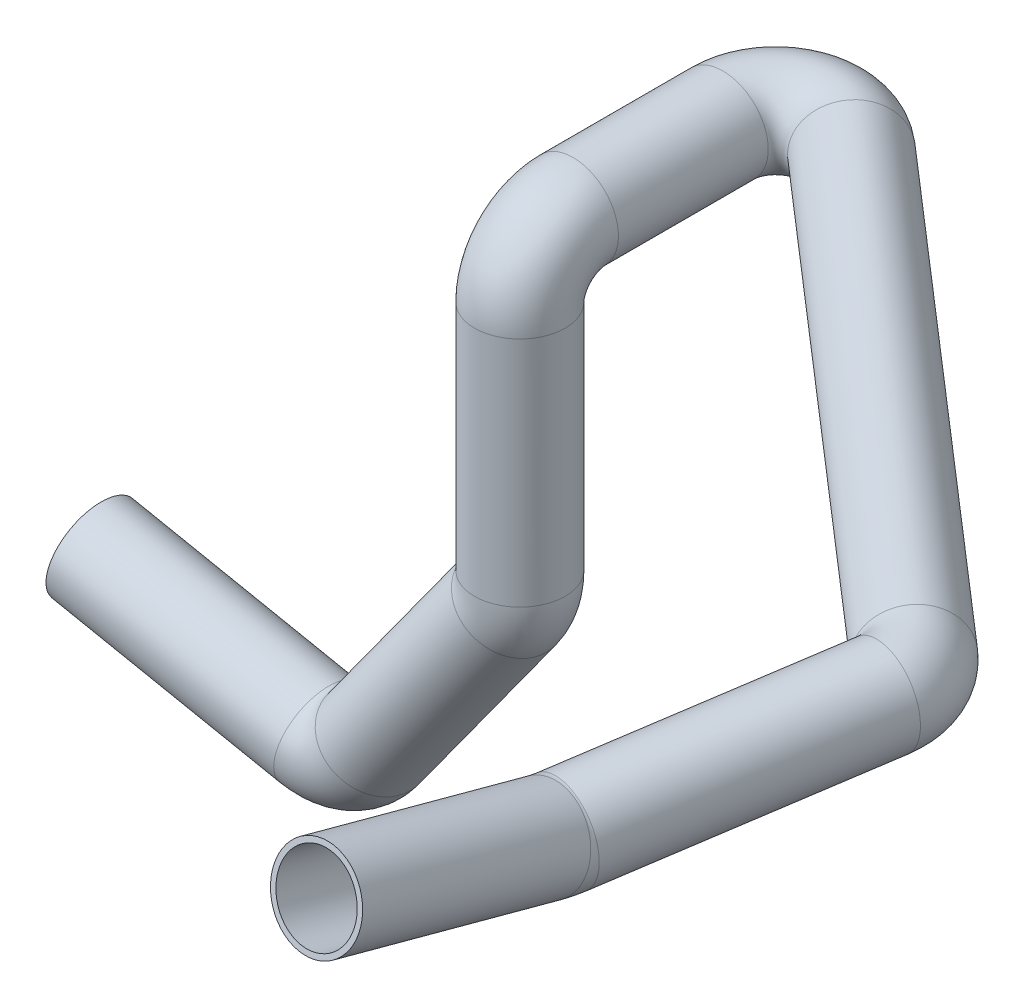
ISO-10303-21;
HEADER;
FILE_DESCRIPTION(('STEP AP214'),'2;1');
FILE_NAME('part.step','',(''),(''),'','','');
FILE_SCHEMA(('AUTOMOTIVE_DESIGN { 1 0 10303 214 1 1 1 1 }'));
ENDSEC;
DATA;
#1=APPLICATION_CONTEXT('core data for automotive mechanical design processes');
#2=APPLICATION_PROTOCOL_DEFINITION('international standard','automotive_design',2000,#1);
#3=PRODUCT_CONTEXT('',#1,'mechanical');
#4=PRODUCT('Part','Part','',(#3));
#5=PRODUCT_RELATED_PRODUCT_CATEGORY('part','',(#4));
#6=PRODUCT_DEFINITION_FORMATION('','',#4);
#7=PRODUCT_DEFINITION_CONTEXT('part definition',#1,'design');
#8=PRODUCT_DEFINITION('design','',#6,#7);
#9=PRODUCT_DEFINITION_SHAPE('','',#8);
#10=(LENGTH_UNIT() NAMED_UNIT(*) SI_UNIT(.MILLI.,.METRE.));
#11=(NAMED_UNIT(*) PLANE_ANGLE_UNIT() SI_UNIT($,.RADIAN.));
#12=(NAMED_UNIT(*) SI_UNIT($,.STERADIAN.) SOLID_ANGLE_UNIT());
#13=UNCERTAINTY_MEASURE_WITH_UNIT(LENGTH_MEASURE(1.E-05),#10,'distance_accuracy_value','');
#14=(GEOMETRIC_REPRESENTATION_CONTEXT(3) GLOBAL_UNCERTAINTY_ASSIGNED_CONTEXT((#13)) GLOBAL_UNIT_ASSIGNED_CONTEXT((#10,
#11,#12)) REPRESENTATION_CONTEXT('',''));
#15=CARTESIAN_POINT('',(0.,0.,0.));
#16=DIRECTION('',(0.,0.,1.));
#17=DIRECTION('',(1.,0.,0.));
#18=AXIS2_PLACEMENT_3D('',#15,#16,#17);
#19=CARTESIAN_POINT('',(1.11022302462516E-13,0.,0.));
#20=DIRECTION('',(-0.980523442214613,0.196402085700758,0.));
#21=DIRECTION('',(-0.00855716664980716,-0.042721045803236,0.999050392695186));
#22=AXIS2_PLACEMENT_3D('',#19,#20,#21);
#23=PLANE('',#22);
#24=CARTESIAN_POINT('',(1.11022302462516E-13,0.,0.));
#25=DIRECTION('',(-0.980523442214613,0.196402085700758,0.));
#26=DIRECTION('',(-0.00855716664980716,-0.042721045803236,0.999050392695186));
#27=AXIS2_PLACEMENT_3D('',#24,#25,#26);
#28=CIRCLE('',#27,15.);
#29=CARTESIAN_POINT('',(-0.128357499746996,-0.64081568704854,14.9857558904277));
#30=VERTEX_POINT('',#29);
#31=EDGE_CURVE('E403',#30,#30,#28,.T.);
#32=ORIENTED_EDGE('',*,*,#31,.F.);
#33=EDGE_LOOP('',(#32));
#34=FACE_BOUND('',#33,.T.);
#35=CARTESIAN_POINT('',(1.11022302462516E-13,0.,0.));
#36=DIRECTION('',(-0.980523442214613,0.196402085700758,0.));
#37=DIRECTION('',(-0.196402085700758,-0.980523442214612,0.));
#38=AXIS2_PLACEMENT_3D('',#35,#36,#37);
#39=CIRCLE('',#38,17.);
#40=CARTESIAN_POINT('',(-3.33883545691277,-16.6688985176484,0.));
#41=VERTEX_POINT('',#40);
#42=EDGE_CURVE('E62',#41,#41,#39,.T.);
#43=ORIENTED_EDGE('',*,*,#42,.T.);
#44=EDGE_LOOP('',(#43));
#45=FACE_BOUND('',#44,.T.);
#46=ADVANCED_FACE('F43',(#34,#45),#23,.T.);
#47=CARTESIAN_POINT('',(356.08970432357,200.149000261823,271.863945724167));
#48=DIRECTION('',(0.0144610619983853,-0.251041204899165,-0.967868374898495));
#49=DIRECTION('',(0.,0.967969592211033,-0.2510674581757));
#50=AXIS2_PLACEMENT_3D('',#47,#48,#49);
#51=PLANE('',#50);
#52=CARTESIAN_POINT('',(356.08970432357,200.149000261823,271.863945724167));
#53=DIRECTION('',(0.0144610619983853,-0.251041204899165,-0.967868374898495));
#54=DIRECTION('',(0.,0.967969592211033,-0.2510674581757));
#55=AXIS2_PLACEMENT_3D('',#52,#53,#54);
#56=CIRCLE('',#55,15.);
#57=CARTESIAN_POINT('',(356.08970432357,214.668544144988,268.097933851532));
#58=VERTEX_POINT('',#57);
#59=EDGE_CURVE('E65',#58,#58,#56,.T.);
#60=ORIENTED_EDGE('',*,*,#59,.T.);
#61=EDGE_LOOP('',(#60));
#62=FACE_BOUND('',#61,.T.);
#63=CARTESIAN_POINT('',(356.08970432357,200.149000261823,271.863945724167));
#64=DIRECTION('',(0.0144610619983853,-0.251041204899165,-0.967868374898495));
#65=DIRECTION('',(0.,0.967969592211033,-0.2510674581757));
#66=AXIS2_PLACEMENT_3D('',#63,#64,#65);
#67=CIRCLE('',#66,17.);
#68=CARTESIAN_POINT('',(356.08970432357,216.60448332941,267.595798935181));
#69=VERTEX_POINT('',#68);
#70=EDGE_CURVE('E11',#69,#69,#67,.T.);
#71=ORIENTED_EDGE('',*,*,#70,.F.);
#72=EDGE_LOOP('',(#71));
#73=FACE_BOUND('',#72,.T.);
#74=ADVANCED_FACE('F181',(#62,#73),#51,.F.);
#75=CARTESIAN_POINT('',(1.11022302462516E-13,0.,0.));
#76=DIRECTION('',(0.980523442214612,-0.196402085700759,0.));
#77=DIRECTION('',(0.196402085700759,0.980523442214612,0.));
#78=AXIS2_PLACEMENT_3D('',#75,#76,#77);
#79=CYLINDRICAL_SURFACE('',#78,17.);
#80=CARTESIAN_POINT('',(85.4614389727629,-17.1182086410179,0.));
#81=DIRECTION('',(0.980523442214612,-0.196402085700759,0.));
#82=DIRECTION('',(0.196402085700759,0.980523442214612,0.));
#83=AXIS2_PLACEMENT_3D('',#80,#81,#82);
#84=CIRCLE('',#83,17.);
#85=CARTESIAN_POINT('',(82.1226035158501,-33.7871071586663,0.));
#86=VERTEX_POINT('',#85);
#87=EDGE_CURVE('E64',#86,#86,#84,.F.);
#88=ORIENTED_EDGE('',*,*,#87,.T.);
#89=EDGE_LOOP('',(#88));
#90=FACE_BOUND('',#89,.T.);
#91=ORIENTED_EDGE('',*,*,#42,.F.);
#92=EDGE_LOOP('',(#91));
#93=FACE_BOUND('',#92,.T.);
#94=ADVANCED_FACE('F184',(#90,#93),#79,.T.);
#95=CARTESIAN_POINT('',(89.389480686778,2.49226020327438,0.));
#96=DIRECTION('',(0.,0.,1.));
#97=DIRECTION('',(1.,0.,0.));
#98=AXIS2_PLACEMENT_3D('',#95,#96,#97);
#99=TOROIDAL_SURFACE('',#98,20.,17.);
#100=CARTESIAN_POINT('',(105.585882460792,-9.24130573273696,0.));
#101=DIRECTION('',(-0.586678296800567,-0.809820088700685,0.));
#102=DIRECTION('',(0.809820088700685,-0.586678296800567,0.));
#103=AXIS2_PLACEMENT_3D('',#100,#101,#102);
#104=CIRCLE('',#103,17.);
#105=CARTESIAN_POINT('',(119.352823968703,-19.2148367783466,0.));
#106=VERTEX_POINT('',#105);
#107=EDGE_CURVE('E69',#106,#106,#104,.T.);
#108=CARTESIAN_POINT('',(89.389480686778,2.49226020327438,0.));
#109=DIRECTION('',(0.,0.,1.));
#110=DIRECTION('',(1.,0.,0.));
#111=AXIS2_PLACEMENT_3D('',#108,#109,#110);
#112=CIRCLE('',#111,37.);
#113=EDGE_CURVE('',#86,#106,#112,.T.);
#114=ORIENTED_EDGE('',*,*,#87,.F.);
#115=ORIENTED_EDGE('',*,*,#107,.T.);
#116=ORIENTED_EDGE('',*,*,#113,.T.);
#117=ORIENTED_EDGE('',*,*,#113,.F.);
#118=EDGE_LOOP('',(#114,#116,#115,#117));
#119=FACE_BOUND('',#118,.T.);
#120=ADVANCED_FACE('F190',(#119),#99,.T.);
#121=CARTESIAN_POINT('',(105.585882460792,-9.24130573273701,0.));
#122=DIRECTION('',(0.58667829680057,0.809820088700683,0.));
#123=DIRECTION('',(-0.809820088700683,0.58667829680057,0.));
#124=AXIS2_PLACEMENT_3D('',#121,#122,#123);
#125=CYLINDRICAL_SURFACE('',#124,17.);
#126=CARTESIAN_POINT('',(156.720173901518,61.3418002999924,0.));
#127=DIRECTION('',(0.58667829680057,0.809820088700683,0.));
#128=DIRECTION('',(-0.809820088700683,0.58667829680057,0.));
#129=AXIS2_PLACEMENT_3D('',#126,#127,#128);
#130=CIRCLE('',#129,17.);
#131=CARTESIAN_POINT('',(170.48711540943,51.3682692543827,0.));
#132=VERTEX_POINT('',#131);
#133=EDGE_CURVE('E83',#132,#132,#130,.F.);
#134=ORIENTED_EDGE('',*,*,#133,.T.);
#135=EDGE_LOOP('',(#134));
#136=FACE_BOUND('',#135,.T.);
#137=ORIENTED_EDGE('',*,*,#107,.F.);
#138=EDGE_LOOP('',(#137));
#139=FACE_BOUND('',#138,.T.);
#140=ADVANCED_FACE('F194',(#136,#139),#125,.T.);
#141=CARTESIAN_POINT('',(140.523772127505,73.0753662360038,0.));
#142=DIRECTION('',(0.,0.,1.));
#143=DIRECTION('',(1.,0.,0.));
#144=AXIS2_PLACEMENT_3D('',#141,#142,#143);
#145=TOROIDAL_SURFACE('',#144,20.0000000000001,17.);
#146=CARTESIAN_POINT('',(160.523772127505,73.0753662360039,0.));
#147=DIRECTION('',(0.,-1.,0.));
#148=DIRECTION('',(1.,0.,0.));
#149=AXIS2_PLACEMENT_3D('',#146,#147,#148);
#150=CIRCLE('',#149,17.);
#151=CARTESIAN_POINT('',(177.523772127505,73.0753662360039,0.));
#152=VERTEX_POINT('',#151);
#153=EDGE_CURVE('E86',#152,#152,#150,.T.);
#154=CARTESIAN_POINT('',(140.523772127505,73.0753662360038,0.));
#155=DIRECTION('',(0.,0.,1.));
#156=DIRECTION('',(1.,0.,0.));
#157=AXIS2_PLACEMENT_3D('',#154,#155,#156);
#158=CIRCLE('',#157,37.0000000000001);
#159=EDGE_CURVE('',#132,#152,#158,.T.);
#160=ORIENTED_EDGE('',*,*,#133,.F.);
#161=ORIENTED_EDGE('',*,*,#153,.T.);
#162=ORIENTED_EDGE('',*,*,#159,.T.);
#163=ORIENTED_EDGE('',*,*,#159,.F.);
#164=EDGE_LOOP('',(#160,#162,#161,#163));
#165=FACE_BOUND('',#164,.T.);
#166=ADVANCED_FACE('F198',(#165),#145,.T.);
#167=CARTESIAN_POINT('',(160.523772127505,73.0753662360039,0.));
#168=DIRECTION('',(0.,1.,0.));
#169=DIRECTION('',(-1.,0.,0.));
#170=AXIS2_PLACEMENT_3D('',#167,#168,#169);
#171=CYLINDRICAL_SURFACE('',#170,17.);
#172=CARTESIAN_POINT('',(160.523772127505,160.234362434748,0.));
#173=DIRECTION('',(0.,1.,0.));
#174=DIRECTION('',(-1.,0.,0.));
#175=AXIS2_PLACEMENT_3D('',#172,#173,#174);
#176=CIRCLE('',#175,17.);
#177=CARTESIAN_POINT('',(160.523772127505,160.234362434748,17.));
#178=VERTEX_POINT('',#177);
#179=EDGE_CURVE('E89',#178,#178,#176,.F.);
#180=ORIENTED_EDGE('',*,*,#179,.T.);
#181=EDGE_LOOP('',(#180));
#182=FACE_BOUND('',#181,.T.);
#183=ORIENTED_EDGE('',*,*,#153,.F.);
#184=EDGE_LOOP('',(#183));
#185=FACE_BOUND('',#184,.T.);
#186=ADVANCED_FACE('F202',(#182,#185),#171,.T.);
#187=CARTESIAN_POINT('',(160.523772127504,160.234362434748,-20.));
#188=DIRECTION('',(-1.,0.,0.));
#189=DIRECTION('',(0.,0.,1.));
#190=AXIS2_PLACEMENT_3D('',#187,#188,#189);
#191=TOROIDAL_SURFACE('',#190,20.,17.);
#192=CARTESIAN_POINT('',(160.523772127504,180.234362434748,-20.0000000000001));
#193=DIRECTION('',(0.,0.,1.));
#194=DIRECTION('',(0.,-1.,0.));
#195=AXIS2_PLACEMENT_3D('',#192,#193,#194);
#196=CIRCLE('',#195,17.);
#197=CARTESIAN_POINT('',(160.523772127504,197.234362434748,-20.0000000000001));
#198=VERTEX_POINT('',#197);
#199=EDGE_CURVE('E92',#198,#198,#196,.T.);
#200=CARTESIAN_POINT('',(160.523772127504,160.234362434748,-20.));
#201=DIRECTION('',(-1.,0.,0.));
#202=DIRECTION('',(0.,0.,1.));
#203=AXIS2_PLACEMENT_3D('',#200,#201,#202);
#204=CIRCLE('',#203,37.);
#205=EDGE_CURVE('',#178,#198,#204,.T.);
#206=ORIENTED_EDGE('',*,*,#179,.F.);
#207=ORIENTED_EDGE('',*,*,#199,.T.);
#208=ORIENTED_EDGE('',*,*,#205,.T.);
#209=ORIENTED_EDGE('',*,*,#205,.F.);
#210=EDGE_LOOP('',(#206,#208,#207,#209));
#211=FACE_BOUND('',#210,.T.);
#212=ADVANCED_FACE('F206',(#211),#191,.T.);
#213=CARTESIAN_POINT('',(160.523772127504,180.234362434748,-20.0000000000001));
#214=DIRECTION('',(0.,0.,-1.));
#215=DIRECTION('',(-1.,0.,0.));
#216=AXIS2_PLACEMENT_3D('',#213,#214,#215);
#217=CYLINDRICAL_SURFACE('',#216,17.);
#218=CARTESIAN_POINT('',(160.523772127504,180.234362434748,-76.2420236567887));
#219=DIRECTION('',(0.,0.,-1.));
#220=DIRECTION('',(-1.,0.,0.));
#221=AXIS2_PLACEMENT_3D('',#218,#219,#220);
#222=CIRCLE('',#221,17.);
#223=CARTESIAN_POINT('',(143.524412527916,180.381919894281,-76.2420236567888));
#224=VERTEX_POINT('',#223);
#225=EDGE_CURVE('E95',#224,#224,#222,.F.);
#226=ORIENTED_EDGE('',*,*,#225,.T.);
#227=EDGE_LOOP('',(#226));
#228=FACE_BOUND('',#227,.T.);
#229=ORIENTED_EDGE('',*,*,#199,.F.);
#230=EDGE_LOOP('',(#229));
#231=FACE_BOUND('',#230,.T.);
#232=ADVANCED_FACE('F210',(#228,#231),#217,.T.);
#233=CARTESIAN_POINT('',(180.523018715256,180.060765423532,-76.2420236567887));
#234=DIRECTION('',(-0.00867985056078324,-0.999962329387584,0.));
#235=DIRECTION('',(0.999962329387584,-0.00867985056078324,0.));
#236=AXIS2_PLACEMENT_3D('',#233,#234,#235);
#237=TOROIDAL_SURFACE('',#236,20.0000000000001,17.);
#238=CARTESIAN_POINT('',(193.610363482465,179.947164947316,-91.365135171157));
#239=DIRECTION('',(-0.756127090874792,0.00656331739793882,-0.654391889703684));
#240=DIRECTION('',(-0.654405984823044,0.,0.756143377295459));
#241=AXIS2_PLACEMENT_3D('',#238,#239,#240);
#242=CIRCLE('',#241,17.);
#243=CARTESIAN_POINT('',(204.734606534593,179.850604542532,-104.21977995837));
#244=VERTEX_POINT('',#243);
#245=EDGE_CURVE('E98',#244,#244,#242,.T.);
#246=CARTESIAN_POINT('',(180.523018715256,180.060765423532,-76.2420236567887));
#247=DIRECTION('',(-0.00867985056078324,-0.999962329387584,0.));
#248=DIRECTION('',(0.999962329387584,-0.00867985056078324,0.));
#249=AXIS2_PLACEMENT_3D('',#246,#247,#248);
#250=CIRCLE('',#249,37.);
#251=EDGE_CURVE('',#224,#244,#250,.T.);
#252=ORIENTED_EDGE('',*,*,#225,.F.);
#253=ORIENTED_EDGE('',*,*,#245,.T.);
#254=ORIENTED_EDGE('',*,*,#251,.T.);
#255=ORIENTED_EDGE('',*,*,#251,.F.);
#256=EDGE_LOOP('',(#252,#254,#253,#255));
#257=FACE_BOUND('',#256,.T.);
#258=ADVANCED_FACE('F214',(#257),#237,.T.);
#259=CARTESIAN_POINT('',(193.610363482465,179.947164947316,-91.3651351711569));
#260=DIRECTION('',(0.756127090874794,-0.00656331739793893,0.654391889703681));
#261=DIRECTION('',(0.65440598482304,0.,-0.756143377295461));
#262=AXIS2_PLACEMENT_3D('',#259,#260,#261);
#263=CYLINDRICAL_SURFACE('',#262,17.);
#264=CARTESIAN_POINT('',(367.850155378574,178.434732617664,59.4310842164534));
#265=DIRECTION('',(0.756127090874794,-0.00656331739793893,0.654391889703681));
#266=DIRECTION('',(0.65440598482304,0.,-0.756143377295461));
#267=AXIS2_PLACEMENT_3D('',#264,#265,#266);
#268=CIRCLE('',#267,17.);
#269=CARTESIAN_POINT('',(378.975315418049,178.507075913406,46.577073926134));
#270=VERTEX_POINT('',#269);
#271=EDGE_CURVE('E101',#270,#270,#268,.F.);
#272=ORIENTED_EDGE('',*,*,#271,.T.);
#273=EDGE_LOOP('',(#272));
#274=FACE_BOUND('',#273,.T.);
#275=ORIENTED_EDGE('',*,*,#245,.F.);
#276=EDGE_LOOP('',(#275));
#277=FACE_BOUND('',#276,.T.);
#278=ADVANCED_FACE('F118',(#274,#277),#263,.T.);
#279=CARTESIAN_POINT('',(354.761731802722,178.349622857967,74.5534492638881));
#280=DIRECTION('',(-0.00217788725668244,-0.999969406375387,-0.00751286365857432));
#281=DIRECTION('',(0.,0.0075128814761185,-0.99997177790772));
#282=AXIS2_PLACEMENT_3D('',#279,#280,#281);
#283=TOROIDAL_SURFACE('',#282,20.,17.);
#284=CARTESIAN_POINT('',(374.510110601769,178.282856784244,77.7152647393318));
#285=DIRECTION('',(0.158111017422843,0.00707403998815843,-0.987396001677016));
#286=DIRECTION('',(-0.987420708260268,0.,-0.158114973670395));
#287=AXIS2_PLACEMENT_3D('',#284,#285,#286);
#288=CIRCLE('',#287,17.);
#289=CARTESIAN_POINT('',(391.296232580958,178.226105621579,80.402807893459));
#290=VERTEX_POINT('',#289);
#291=EDGE_CURVE('E59',#290,#290,#288,.T.);
#292=CARTESIAN_POINT('',(354.761731802722,178.349622857967,74.5534492638881));
#293=DIRECTION('',(-0.00217788725668244,-0.999969406375387,-0.00751286365857432));
#294=DIRECTION('',(0.,0.0075128814761185,-0.99997177790772));
#295=AXIS2_PLACEMENT_3D('',#292,#293,#294);
#296=CIRCLE('',#295,37.);
#297=EDGE_CURVE('',#270,#290,#296,.T.);
#298=ORIENTED_EDGE('',*,*,#271,.F.);
#299=ORIENTED_EDGE('',*,*,#291,.T.);
#300=ORIENTED_EDGE('',*,*,#297,.T.);
#301=ORIENTED_EDGE('',*,*,#297,.F.);
#302=EDGE_LOOP('',(#298,#300,#299,#301));
#303=FACE_BOUND('',#302,.T.);
#304=ADVANCED_FACE('F106',(#303),#283,.T.);
#305=CARTESIAN_POINT('',(374.510110601769,178.282856784244,77.7152647393317));
#306=DIRECTION('',(-0.158111017422835,-0.00707403998815889,0.987396001677018));
#307=DIRECTION('',(0.98742070826027,0.,0.158114973670387));
#308=AXIS2_PLACEMENT_3D('',#305,#306,#307);
#309=CYLINDRICAL_SURFACE('',#308,17.);
#310=CARTESIAN_POINT('',(357.866690044366,177.538214035864,181.652657468013));
#311=DIRECTION('',(-0.158111017422835,-0.00707403998815889,0.987396001677018));
#312=DIRECTION('',(0.98742070826027,0.,0.158114973670387));
#313=AXIS2_PLACEMENT_3D('',#310,#311,#312);
#314=CIRCLE('',#313,17.);
#315=CARTESIAN_POINT('',(349.928071667574,162.568971777615,180.27420743935));
#316=VERTEX_POINT('',#315);
#317=EDGE_CURVE('E54',#316,#316,#314,.F.);
#318=ORIENTED_EDGE('',*,*,#317,.T.);
#319=EDGE_LOOP('',(#318));
#320=FACE_BOUND('',#319,.T.);
#321=ORIENTED_EDGE('',*,*,#291,.F.);
#322=EDGE_LOOP('',(#321));
#323=FACE_BOUND('',#322,.T.);
#324=ADVANCED_FACE('F109',(#320,#323),#309,.T.);
#325=CARTESIAN_POINT('',(367.206241075885,195.149087280863,183.274363384087));
#326=DIRECTION('',(-0.870018892032596,0.473912245916593,-0.135920236450147));
#327=DIRECTION('',(-0.478351450967584,-0.878168485745877,0.));
#328=AXIS2_PLACEMENT_3D('',#325,#326,#327);
#329=TOROIDAL_SURFACE('',#328,20.0000000000001,17.);
#330=CARTESIAN_POINT('',(357.350115971317,178.268500838288,187.505509715505));
#331=DIRECTION('',(0.0144610619983942,-0.251041204899154,-0.967868374898498));
#332=DIRECTION('',(0.,0.967969592211036,-0.25106745817569));
#333=AXIS2_PLACEMENT_3D('',#330,#331,#332);
#334=CIRCLE('',#333,17.);
#335=CARTESIAN_POINT('',(348.972409632434,163.9200023621,191.10198409721));
#336=VERTEX_POINT('',#335);
#337=EDGE_CURVE('E50',#336,#336,#334,.T.);
#338=CARTESIAN_POINT('',(367.206241075885,195.149087280863,183.274363384087));
#339=DIRECTION('',(-0.870018892032596,0.473912245916593,-0.135920236450147));
#340=DIRECTION('',(-0.478351450967584,-0.878168485745877,0.));
#341=AXIS2_PLACEMENT_3D('',#338,#339,#340);
#342=CIRCLE('',#341,37.0000000000001);
#343=EDGE_CURVE('',#316,#336,#342,.T.);
#344=ORIENTED_EDGE('',*,*,#317,.F.);
#345=ORIENTED_EDGE('',*,*,#337,.T.);
#346=ORIENTED_EDGE('',*,*,#343,.T.);
#347=ORIENTED_EDGE('',*,*,#343,.F.);
#348=EDGE_LOOP('',(#344,#346,#345,#347));
#349=FACE_BOUND('',#348,.T.);
#350=ADVANCED_FACE('F111',(#349),#329,.T.);
#351=CARTESIAN_POINT('',(357.350115971317,178.268500838288,187.505509715505));
#352=DIRECTION('',(-0.0144610619983863,0.251041204899165,0.967868374898495));
#353=DIRECTION('',(0.,-0.967969592211033,0.251067458175701));
#354=AXIS2_PLACEMENT_3D('',#351,#352,#353);
#355=CYLINDRICAL_SURFACE('',#354,17.);
#356=ORIENTED_EDGE('',*,*,#70,.T.);
#357=EDGE_LOOP('',(#356));
#358=FACE_BOUND('',#357,.T.);
#359=ORIENTED_EDGE('',*,*,#337,.F.);
#360=EDGE_LOOP('',(#359));
#361=FACE_BOUND('',#360,.T.);
#362=ADVANCED_FACE('F45',(#358,#361),#355,.T.);
#363=CARTESIAN_POINT('',(1.11022302462516E-13,0.,0.));
#364=DIRECTION('',(0.980523442214612,-0.196402085700759,0.));
#365=DIRECTION('',(0.196402085700759,0.980523442214612,0.));
#366=AXIS2_PLACEMENT_3D('',#363,#364,#365);
#367=CYLINDRICAL_SURFACE('',#366,15.);
#368=CARTESIAN_POINT('',(85.4614389727629,-17.1182086410179,0.));
#369=DIRECTION('',(-0.980523442214613,0.196402085700758,0.));
#370=DIRECTION('',(-0.00855716664980716,-0.042721045803236,0.999050392695186));
#371=AXIS2_PLACEMENT_3D('',#368,#369,#370);
#372=CIRCLE('',#371,15.);
#373=CARTESIAN_POINT('',(82.5154076872516,-31.8260602742371,0.));
#374=VERTEX_POINT('',#373);
#375=EDGE_CURVE('E404',#374,#374,#372,.T.);
#376=ORIENTED_EDGE('',*,*,#375,.F.);
#377=EDGE_LOOP('',(#376));
#378=FACE_BOUND('',#377,.T.);
#379=ORIENTED_EDGE('',*,*,#31,.T.);
#380=EDGE_LOOP('',(#379));
#381=FACE_BOUND('',#380,.T.);
#382=ADVANCED_FACE('F121',(#378,#381),#367,.F.);
#383=CARTESIAN_POINT('',(89.389480686778,2.49226020327438,0.));
#384=DIRECTION('',(0.,0.,1.));
#385=DIRECTION('',(1.,0.,0.));
#386=AXIS2_PLACEMENT_3D('',#383,#384,#385);
#387=TOROIDAL_SURFACE('',#386,20.,15.);
#388=CARTESIAN_POINT('',(105.585882460792,-9.24130573273696,0.));
#389=DIRECTION('',(-0.586678296800569,-0.809820088700684,0.));
#390=DIRECTION('',(0.0352835634644525,-0.0255613576486992,0.999050392695186));
#391=AXIS2_PLACEMENT_3D('',#388,#389,#390);
#392=CIRCLE('',#391,15.);
#393=CARTESIAN_POINT('',(117.733183791302,-18.0414801847455,0.));
#394=VERTEX_POINT('',#393);
#395=EDGE_CURVE('E407',#394,#394,#392,.T.);
#396=CARTESIAN_POINT('',(89.389480686778,2.49226020327438,0.));
#397=DIRECTION('',(0.,0.,1.));
#398=DIRECTION('',(1.,0.,0.));
#399=AXIS2_PLACEMENT_3D('',#396,#397,#398);
#400=CIRCLE('',#399,35.);
#401=EDGE_CURVE('',#374,#394,#400,.T.);
#402=ORIENTED_EDGE('',*,*,#375,.T.);
#403=ORIENTED_EDGE('',*,*,#395,.F.);
#404=ORIENTED_EDGE('',*,*,#401,.T.);
#405=ORIENTED_EDGE('',*,*,#401,.F.);
#406=EDGE_LOOP('',(#402,#404,#403,#405));
#407=FACE_BOUND('',#406,.T.);
#408=ADVANCED_FACE('F125',(#407),#387,.F.);
#409=CARTESIAN_POINT('',(105.585882460792,-9.24130573273701,0.));
#410=DIRECTION('',(0.58667829680057,0.809820088700683,0.));
#411=DIRECTION('',(-0.809820088700683,0.58667829680057,0.));
#412=AXIS2_PLACEMENT_3D('',#409,#410,#411);
#413=CYLINDRICAL_SURFACE('',#412,15.);
#414=CARTESIAN_POINT('',(156.720173901518,61.3418002999924,0.));
#415=DIRECTION('',(-0.586678296800569,-0.809820088700684,0.));
#416=DIRECTION('',(0.0352835634644525,-0.0255613576486992,0.999050392695186));
#417=AXIS2_PLACEMENT_3D('',#414,#415,#416);
#418=CIRCLE('',#417,15.);
#419=CARTESIAN_POINT('',(168.867475232029,52.5416258479839,0.));
#420=VERTEX_POINT('',#419);
#421=EDGE_CURVE('E412',#420,#420,#418,.T.);
#422=ORIENTED_EDGE('',*,*,#421,.F.);
#423=EDGE_LOOP('',(#422));
#424=FACE_BOUND('',#423,.T.);
#425=ORIENTED_EDGE('',*,*,#395,.T.);
#426=EDGE_LOOP('',(#425));
#427=FACE_BOUND('',#426,.T.);
#428=ADVANCED_FACE('F132',(#424,#427),#413,.F.);
#429=CARTESIAN_POINT('',(140.523772127505,73.0753662360038,0.));
#430=DIRECTION('',(0.,0.,1.));
#431=DIRECTION('',(1.,0.,0.));
#432=AXIS2_PLACEMENT_3D('',#429,#430,#431);
#433=TOROIDAL_SURFACE('',#432,20.0000000000001,15.);
#434=CARTESIAN_POINT('',(160.523772127504,73.0753662360039,0.));
#435=DIRECTION('',(0.,-1.,0.));
#436=DIRECTION('',(0.0435696322637082,0.,0.999050392695186));
#437=AXIS2_PLACEMENT_3D('',#434,#435,#436);
#438=CIRCLE('',#437,15.);
#439=CARTESIAN_POINT('',(175.523772127505,73.0753662360039,0.));
#440=VERTEX_POINT('',#439);
#441=EDGE_CURVE('E415',#440,#440,#438,.T.);
#442=CARTESIAN_POINT('',(140.523772127505,73.0753662360038,0.));
#443=DIRECTION('',(0.,0.,1.));
#444=DIRECTION('',(1.,0.,0.));
#445=AXIS2_PLACEMENT_3D('',#442,#443,#444);
#446=CIRCLE('',#445,35.0000000000001);
#447=EDGE_CURVE('',#420,#440,#446,.T.);
#448=ORIENTED_EDGE('',*,*,#421,.T.);
#449=ORIENTED_EDGE('',*,*,#441,.F.);
#450=ORIENTED_EDGE('',*,*,#447,.T.);
#451=ORIENTED_EDGE('',*,*,#447,.F.);
#452=EDGE_LOOP('',(#448,#450,#449,#451));
#453=FACE_BOUND('',#452,.T.);
#454=ADVANCED_FACE('F140',(#453),#433,.F.);
#455=CARTESIAN_POINT('',(160.523772127505,73.0753662360039,0.));
#456=DIRECTION('',(0.,1.,0.));
#457=DIRECTION('',(-1.,0.,0.));
#458=AXIS2_PLACEMENT_3D('',#455,#456,#457);
#459=CYLINDRICAL_SURFACE('',#458,15.);
#460=CARTESIAN_POINT('',(160.523772127505,160.234362434748,0.));
#461=DIRECTION('',(0.,-1.,0.));
#462=DIRECTION('',(0.0435696322637082,0.,0.999050392695186));
#463=AXIS2_PLACEMENT_3D('',#460,#461,#462);
#464=CIRCLE('',#463,15.);
#465=CARTESIAN_POINT('',(160.523772127505,160.234362434748,15.));
#466=VERTEX_POINT('',#465);
#467=EDGE_CURVE('E418',#466,#466,#464,.T.);
#468=ORIENTED_EDGE('',*,*,#467,.F.);
#469=EDGE_LOOP('',(#468));
#470=FACE_BOUND('',#469,.T.);
#471=ORIENTED_EDGE('',*,*,#441,.T.);
#472=EDGE_LOOP('',(#471));
#473=FACE_BOUND('',#472,.T.);
#474=ADVANCED_FACE('F144',(#470,#473),#459,.F.);
#475=CARTESIAN_POINT('',(160.523772127504,160.234362434748,-20.));
#476=DIRECTION('',(-1.,0.,0.));
#477=DIRECTION('',(0.,0.,1.));
#478=AXIS2_PLACEMENT_3D('',#475,#476,#477);
#479=TOROIDAL_SURFACE('',#478,20.,15.);
#480=CARTESIAN_POINT('',(160.523772127504,180.234362434748,-20.));
#481=DIRECTION('',(0.,0.,1.));
#482=DIRECTION('',(0.0435696322637082,0.999050392695186,0.));
#483=AXIS2_PLACEMENT_3D('',#480,#481,#482);
#484=CIRCLE('',#483,15.);
#485=CARTESIAN_POINT('',(160.523772127504,195.234362434748,-20.));
#486=VERTEX_POINT('',#485);
#487=EDGE_CURVE('E421',#486,#486,#484,.T.);
#488=CARTESIAN_POINT('',(160.523772127504,160.234362434748,-20.));
#489=DIRECTION('',(-1.,0.,0.));
#490=DIRECTION('',(0.,0.,1.));
#491=AXIS2_PLACEMENT_3D('',#488,#489,#490);
#492=CIRCLE('',#491,35.);
#493=EDGE_CURVE('',#466,#486,#492,.T.);
#494=ORIENTED_EDGE('',*,*,#467,.T.);
#495=ORIENTED_EDGE('',*,*,#487,.F.);
#496=ORIENTED_EDGE('',*,*,#493,.T.);
#497=ORIENTED_EDGE('',*,*,#493,.F.);
#498=EDGE_LOOP('',(#494,#496,#495,#497));
#499=FACE_BOUND('',#498,.T.);
#500=ADVANCED_FACE('F148',(#499),#479,.F.);
#501=CARTESIAN_POINT('',(160.523772127504,180.234362434748,-20.0000000000001));
#502=DIRECTION('',(0.,0.,-1.));
#503=DIRECTION('',(-1.,0.,0.));
#504=AXIS2_PLACEMENT_3D('',#501,#502,#503);
#505=CYLINDRICAL_SURFACE('',#504,15.);
#506=CARTESIAN_POINT('',(160.523772127504,180.234362434748,-76.2420236567887));
#507=DIRECTION('',(0.,0.,1.));
#508=DIRECTION('',(0.0435696322637082,0.999050392695186,0.));
#509=AXIS2_PLACEMENT_3D('',#506,#507,#508);
#510=CIRCLE('',#509,15.);
#511=CARTESIAN_POINT('',(145.524337186691,180.36456019316,-76.2420236567888));
#512=VERTEX_POINT('',#511);
#513=EDGE_CURVE('E424',#512,#512,#510,.T.);
#514=ORIENTED_EDGE('',*,*,#513,.F.);
#515=EDGE_LOOP('',(#514));
#516=FACE_BOUND('',#515,.T.);
#517=ORIENTED_EDGE('',*,*,#487,.T.);
#518=EDGE_LOOP('',(#517));
#519=FACE_BOUND('',#518,.T.);
#520=ADVANCED_FACE('F152',(#516,#519),#505,.F.);
#521=CARTESIAN_POINT('',(180.523018715256,180.060765423532,-76.2420236567887));
#522=DIRECTION('',(-0.00867985056078324,-0.999962329387584,0.));
#523=DIRECTION('',(0.999962329387584,-0.00867985056078324,0.));
#524=AXIS2_PLACEMENT_3D('',#521,#522,#523);
#525=TOROIDAL_SURFACE('',#524,20.0000000000001,15.);
#526=CARTESIAN_POINT('',(193.610363482465,179.947164947316,-91.3651351711569));
#527=DIRECTION('',(-0.756127090874795,0.00656331739793906,-0.65439188970368));
#528=DIRECTION('',(-0.0141604857052267,0.999551500369045,0.0263870944702485));
#529=AXIS2_PLACEMENT_3D('',#526,#527,#528);
#530=CIRCLE('',#529,15.);
#531=CARTESIAN_POINT('',(203.425872057872,179.861964590154,-102.707468806933));
#532=VERTEX_POINT('',#531);
#533=EDGE_CURVE('E427',#532,#532,#530,.T.);
#534=CARTESIAN_POINT('',(180.523018715256,180.060765423532,-76.2420236567887));
#535=DIRECTION('',(-0.00867985056078324,-0.999962329387584,0.));
#536=DIRECTION('',(0.999962329387584,-0.00867985056078324,0.));
#537=AXIS2_PLACEMENT_3D('',#534,#535,#536);
#538=CIRCLE('',#537,35.);
#539=EDGE_CURVE('',#512,#532,#538,.T.);
#540=ORIENTED_EDGE('',*,*,#513,.T.);
#541=ORIENTED_EDGE('',*,*,#533,.F.);
#542=ORIENTED_EDGE('',*,*,#539,.T.);
#543=ORIENTED_EDGE('',*,*,#539,.F.);
#544=EDGE_LOOP('',(#540,#542,#541,#543));
#545=FACE_BOUND('',#544,.T.);
#546=ADVANCED_FACE('F156',(#545),#525,.F.);
#547=CARTESIAN_POINT('',(193.610363482465,179.947164947316,-91.3651351711569));
#548=DIRECTION('',(0.756127090874794,-0.00656331739793893,0.654391889703681));
#549=DIRECTION('',(0.65440598482304,0.,-0.756143377295461));
#550=AXIS2_PLACEMENT_3D('',#547,#548,#549);
#551=CYLINDRICAL_SURFACE('',#550,15.);
#552=CARTESIAN_POINT('',(367.850155378574,178.434732617664,59.4310842164535));
#553=DIRECTION('',(-0.756127090874795,0.00656331739793911,-0.65439188970368));
#554=DIRECTION('',(-0.0141604857052266,0.999551500369046,0.0263870944702485));
#555=AXIS2_PLACEMENT_3D('',#552,#553,#554);
#556=CIRCLE('',#555,15.);
#557=CARTESIAN_POINT('',(377.666473060464,178.498564937436,48.0893104308775));
#558=VERTEX_POINT('',#557);
#559=EDGE_CURVE('E430',#558,#558,#556,.T.);
#560=ORIENTED_EDGE('',*,*,#559,.F.);
#561=EDGE_LOOP('',(#560));
#562=FACE_BOUND('',#561,.T.);
#563=ORIENTED_EDGE('',*,*,#533,.T.);
#564=EDGE_LOOP('',(#563));
#565=FACE_BOUND('',#564,.T.);
#566=ADVANCED_FACE('F160',(#562,#565),#551,.F.);
#567=CARTESIAN_POINT('',(354.761731802722,178.349622857967,74.5534492638881));
#568=DIRECTION('',(-0.00217788725668244,-0.999969406375387,-0.00751286365857432));
#569=DIRECTION('',(0.,0.0075128814761185,-0.99997177790772));
#570=AXIS2_PLACEMENT_3D('',#567,#568,#569);
#571=TOROIDAL_SURFACE('',#570,20.,15.);
#572=CARTESIAN_POINT('',(374.510110601769,178.282856784244,77.7152647393318));
#573=DIRECTION('',(0.158111017422834,0.0070740399881587,-0.987396001677018));
#574=DIRECTION('',(-0.0224738101447945,0.999741080183839,0.00356376913182538));
#575=AXIS2_PLACEMENT_3D('',#572,#573,#574);
#576=CIRCLE('',#575,15.);
#577=CARTESIAN_POINT('',(389.321394701054,178.232782228951,80.0866263459146));
#578=VERTEX_POINT('',#577);
#579=EDGE_CURVE('E433',#578,#578,#576,.T.);
#580=CARTESIAN_POINT('',(354.761731802722,178.349622857967,74.5534492638881));
#581=DIRECTION('',(-0.00217788725668244,-0.999969406375387,-0.00751286365857432));
#582=DIRECTION('',(0.,0.0075128814761185,-0.99997177790772));
#583=AXIS2_PLACEMENT_3D('',#580,#581,#582);
#584=CIRCLE('',#583,35.);
#585=EDGE_CURVE('',#558,#578,#584,.T.);
#586=ORIENTED_EDGE('',*,*,#559,.T.);
#587=ORIENTED_EDGE('',*,*,#579,.F.);
#588=ORIENTED_EDGE('',*,*,#585,.T.);
#589=ORIENTED_EDGE('',*,*,#585,.F.);
#590=EDGE_LOOP('',(#586,#588,#587,#589));
#591=FACE_BOUND('',#590,.T.);
#592=ADVANCED_FACE('F164',(#591),#571,.F.);
#593=CARTESIAN_POINT('',(374.510110601769,178.282856784244,77.7152647393317));
#594=DIRECTION('',(-0.158111017422835,-0.00707403998815889,0.987396001677018));
#595=DIRECTION('',(0.98742070826027,0.,0.158114973670387));
#596=AXIS2_PLACEMENT_3D('',#593,#594,#595);
#597=CYLINDRICAL_SURFACE('',#596,15.);
#598=CARTESIAN_POINT('',(357.866690044366,177.538214035864,181.652657468013));
#599=DIRECTION('',(0.158111017422834,0.00707403998815906,-0.987396001677018));
#600=DIRECTION('',(-0.0224738101447945,0.999741080183839,0.00356376913182579));
#601=AXIS2_PLACEMENT_3D('',#598,#599,#600);
#602=CIRCLE('',#601,15.);
#603=CARTESIAN_POINT('',(350.862026770726,164.330059102115,180.436378030957));
#604=VERTEX_POINT('',#603);
#605=EDGE_CURVE('E77',#604,#604,#602,.T.);
#606=ORIENTED_EDGE('',*,*,#605,.F.);
#607=EDGE_LOOP('',(#606));
#608=FACE_BOUND('',#607,.T.);
#609=ORIENTED_EDGE('',*,*,#579,.T.);
#610=EDGE_LOOP('',(#609));
#611=FACE_BOUND('',#610,.T.);
#612=ADVANCED_FACE('F168',(#608,#611),#597,.F.);
#613=CARTESIAN_POINT('',(367.206241075885,195.149087280863,183.274363384087));
#614=DIRECTION('',(-0.870018892032596,0.473912245916593,-0.135920236450147));
#615=DIRECTION('',(-0.478351450967584,-0.878168485745877,0.));
#616=AXIS2_PLACEMENT_3D('',#613,#614,#615);
#617=TOROIDAL_SURFACE('',#616,20.0000000000001,15.);
#618=CARTESIAN_POINT('',(357.350115971318,178.268500838288,187.505509715504));
#619=DIRECTION('',(0.0144610619983853,-0.251041204899165,-0.967868374898495));
#620=DIRECTION('',(0.,0.967969592211033,-0.2510674581757));
#621=AXIS2_PLACEMENT_3D('',#618,#619,#620);
#622=CIRCLE('',#621,15.);
#623=CARTESIAN_POINT('',(349.958022142891,165.608061006357,190.678869464068));
#624=VERTEX_POINT('',#623);
#625=EDGE_CURVE('E72',#624,#624,#622,.T.);
#626=CARTESIAN_POINT('',(367.206241075885,195.149087280863,183.274363384087));
#627=DIRECTION('',(-0.870018892032596,0.473912245916593,-0.135920236450147));
#628=DIRECTION('',(-0.478351450967584,-0.878168485745877,0.));
#629=AXIS2_PLACEMENT_3D('',#626,#627,#628);
#630=CIRCLE('',#629,35.0000000000001);
#631=EDGE_CURVE('',#604,#624,#630,.T.);
#632=ORIENTED_EDGE('',*,*,#605,.T.);
#633=ORIENTED_EDGE('',*,*,#625,.F.);
#634=ORIENTED_EDGE('',*,*,#631,.T.);
#635=ORIENTED_EDGE('',*,*,#631,.F.);
#636=EDGE_LOOP('',(#632,#634,#633,#635));
#637=FACE_BOUND('',#636,.T.);
#638=ADVANCED_FACE('F172',(#637),#617,.F.);
#639=CARTESIAN_POINT('',(357.350115971317,178.268500838288,187.505509715505));
#640=DIRECTION('',(-0.0144610619983863,0.251041204899165,0.967868374898495));
#641=DIRECTION('',(0.,-0.967969592211033,0.251067458175701));
#642=AXIS2_PLACEMENT_3D('',#639,#640,#641);
#643=CYLINDRICAL_SURFACE('',#642,15.);
#644=ORIENTED_EDGE('',*,*,#59,.F.);
#645=EDGE_LOOP('',(#644));
#646=FACE_BOUND('',#645,.T.);
#647=ORIENTED_EDGE('',*,*,#625,.T.);
#648=EDGE_LOOP('',(#647));
#649=FACE_BOUND('',#648,.T.);
#650=ADVANCED_FACE('F176',(#646,#649),#643,.F.);
#651=CLOSED_SHELL('',(#46,#74,#94,#120,#140,#166,#186,#212,#232,#258,#278,#304,#324,#350,#362,
#382,#408,#428,#454,#474,#500,#520,#546,#566,#592,#612,#638,#650));
#652=MANIFOLD_SOLID_BREP('B2',#651);
#653=ADVANCED_BREP_SHAPE_REPRESENTATION('',(#18,#652),#14);
#654=SHAPE_DEFINITION_REPRESENTATION(#9,#653);
ENDSEC;
END-ISO-10303-21;
